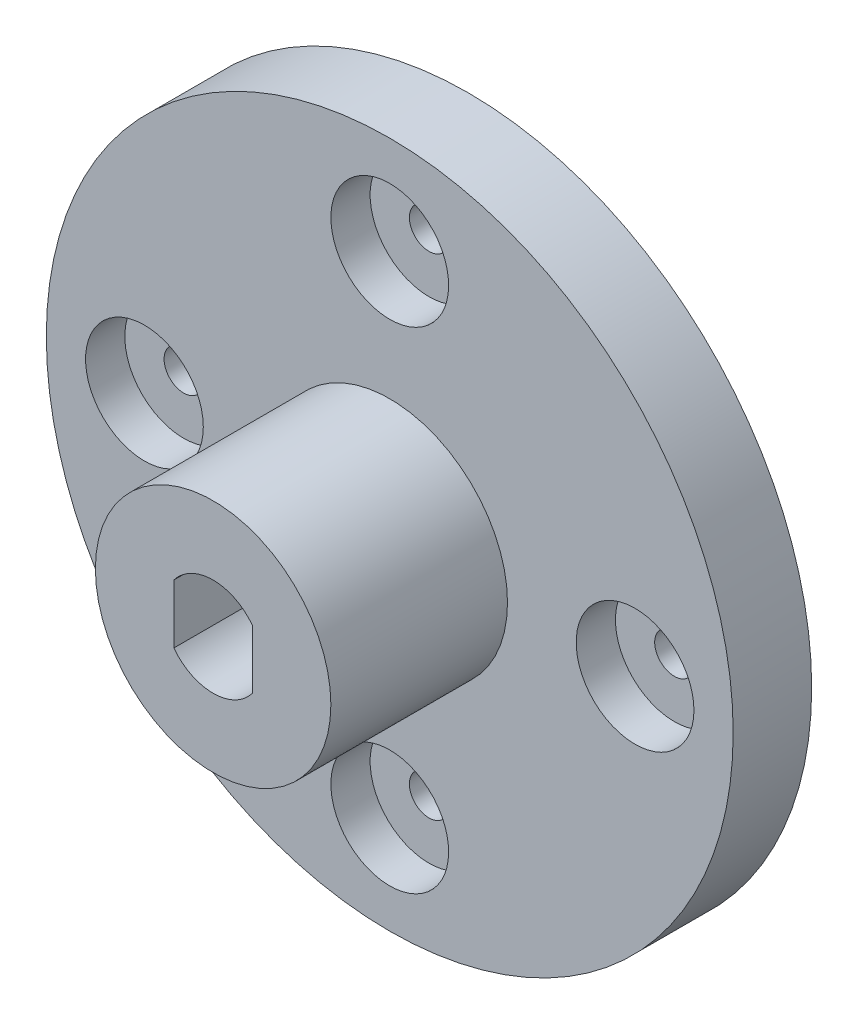
ISO-10303-21;
HEADER;
FILE_DESCRIPTION(('STEP AP214'),'2;1');
FILE_NAME('part.step','',(''),(''),'','','');
FILE_SCHEMA(('AUTOMOTIVE_DESIGN { 1 0 10303 214 1 1 1 1 }'));
ENDSEC;
DATA;
#1=APPLICATION_CONTEXT('core data for automotive mechanical design processes');
#2=APPLICATION_PROTOCOL_DEFINITION('international standard','automotive_design',2000,#1);
#3=PRODUCT_CONTEXT('',#1,'mechanical');
#4=PRODUCT('Part','Part','',(#3));
#5=PRODUCT_RELATED_PRODUCT_CATEGORY('part','',(#4));
#6=PRODUCT_DEFINITION_FORMATION('','',#4);
#7=PRODUCT_DEFINITION_CONTEXT('part definition',#1,'design');
#8=PRODUCT_DEFINITION('design','',#6,#7);
#9=PRODUCT_DEFINITION_SHAPE('','',#8);
#10=(LENGTH_UNIT() NAMED_UNIT(*) SI_UNIT(.MILLI.,.METRE.));
#11=(NAMED_UNIT(*) PLANE_ANGLE_UNIT() SI_UNIT($,.RADIAN.));
#12=(NAMED_UNIT(*) SI_UNIT($,.STERADIAN.) SOLID_ANGLE_UNIT());
#13=UNCERTAINTY_MEASURE_WITH_UNIT(LENGTH_MEASURE(1.E-05),#10,'distance_accuracy_value','');
#14=(GEOMETRIC_REPRESENTATION_CONTEXT(3) GLOBAL_UNCERTAINTY_ASSIGNED_CONTEXT((#13)) GLOBAL_UNIT_ASSIGNED_CONTEXT((#10,
#11,#12)) REPRESENTATION_CONTEXT('',''));
#15=CARTESIAN_POINT('',(0.,0.,0.));
#16=DIRECTION('',(0.,0.,1.));
#17=DIRECTION('',(1.,0.,0.));
#18=AXIS2_PLACEMENT_3D('',#15,#16,#17);
#19=CARTESIAN_POINT('',(0.,0.,9.));
#20=DIRECTION('',(0.,0.,-1.));
#21=DIRECTION('',(-1.,0.,0.));
#22=AXIS2_PLACEMENT_3D('',#19,#20,#21);
#23=CYLINDRICAL_SURFACE('',#22,2.5);
#24=CARTESIAN_POINT('',(0.,0.,0.));
#25=DIRECTION('',(0.,0.,1.));
#26=DIRECTION('',(1.,0.,0.));
#27=AXIS2_PLACEMENT_3D('',#24,#25,#26);
#28=CIRCLE('',#27,2.5);
#29=CARTESIAN_POINT('',(2.,1.5,0.));
#30=VERTEX_POINT('',#29);
#31=CARTESIAN_POINT('',(-2.,1.5,0.));
#32=VERTEX_POINT('',#31);
#33=EDGE_CURVE('E114',#30,#32,#28,.T.);
#34=ORIENTED_EDGE('',*,*,#33,.F.);
#35=DIRECTION('',(0.,0.,-1.));
#36=VECTOR('',#35,1.);
#37=CARTESIAN_POINT('',(2.,1.5,9.));
#38=LINE('',#37,#36);
#39=CARTESIAN_POINT('',(2.,1.5,9.));
#40=VERTEX_POINT('',#39);
#41=EDGE_CURVE('E12',#40,#30,#38,.T.);
#42=ORIENTED_EDGE('',*,*,#41,.F.);
#43=CARTESIAN_POINT('',(0.,0.,9.));
#44=DIRECTION('',(0.,0.,1.));
#45=DIRECTION('',(1.,0.,0.));
#46=AXIS2_PLACEMENT_3D('',#43,#44,#45);
#47=CIRCLE('',#46,2.5);
#48=CARTESIAN_POINT('',(-2.,1.5,9.));
#49=VERTEX_POINT('',#48);
#50=EDGE_CURVE('E96',#40,#49,#47,.T.);
#51=ORIENTED_EDGE('',*,*,#50,.T.);
#52=DIRECTION('',(0.,0.,-1.));
#53=VECTOR('',#52,1.);
#54=CARTESIAN_POINT('',(-2.,1.5,9.));
#55=LINE('',#54,#53);
#56=EDGE_CURVE('E63',#49,#32,#55,.T.);
#57=ORIENTED_EDGE('',*,*,#56,.T.);
#58=EDGE_LOOP('',(#34,#42,#51,#57));
#59=FACE_BOUND('',#58,.T.);
#60=ADVANCED_FACE('F47',(#59),#23,.F.);
#61=CARTESIAN_POINT('',(2.,0.,9.));
#62=DIRECTION('',(1.,0.,0.));
#63=DIRECTION('',(0.,0.,-1.));
#64=AXIS2_PLACEMENT_3D('',#61,#62,#63);
#65=PLANE('',#64);
#66=DIRECTION('',(0.,-1.,0.));
#67=VECTOR('',#66,1.);
#68=CARTESIAN_POINT('',(2.,0.,0.));
#69=LINE('',#68,#67);
#70=CARTESIAN_POINT('',(2.,-1.5,0.));
#71=VERTEX_POINT('',#70);
#72=EDGE_CURVE('E102',#30,#71,#69,.T.);
#73=ORIENTED_EDGE('',*,*,#72,.T.);
#74=DIRECTION('',(0.,0.,-1.));
#75=VECTOR('',#74,1.);
#76=CARTESIAN_POINT('',(2.,-1.5,9.));
#77=LINE('',#76,#75);
#78=CARTESIAN_POINT('',(2.,-1.5,9.));
#79=VERTEX_POINT('',#78);
#80=EDGE_CURVE('E55',#79,#71,#77,.T.);
#81=ORIENTED_EDGE('',*,*,#80,.F.);
#82=DIRECTION('',(0.,-1.,0.));
#83=VECTOR('',#82,1.);
#84=CARTESIAN_POINT('',(2.,0.,9.));
#85=LINE('',#84,#83);
#86=EDGE_CURVE('E89',#40,#79,#85,.T.);
#87=ORIENTED_EDGE('',*,*,#86,.F.);
#88=ORIENTED_EDGE('',*,*,#41,.T.);
#89=EDGE_LOOP('',(#73,#81,#87,#88));
#90=FACE_BOUND('',#89,.T.);
#91=ADVANCED_FACE('F100',(#90),#65,.F.);
#92=CARTESIAN_POINT('',(0.,0.,9.));
#93=DIRECTION('',(0.,0.,-1.));
#94=DIRECTION('',(-1.,0.,0.));
#95=AXIS2_PLACEMENT_3D('',#92,#93,#94);
#96=CYLINDRICAL_SURFACE('',#95,2.5);
#97=CARTESIAN_POINT('',(0.,0.,0.));
#98=DIRECTION('',(0.,0.,1.));
#99=DIRECTION('',(1.,0.,0.));
#100=AXIS2_PLACEMENT_3D('',#97,#98,#99);
#101=CIRCLE('',#100,2.5);
#102=CARTESIAN_POINT('',(-2.,-1.5,0.));
#103=VERTEX_POINT('',#102);
#104=EDGE_CURVE('E117',#103,#71,#101,.T.);
#105=ORIENTED_EDGE('',*,*,#104,.F.);
#106=DIRECTION('',(0.,0.,-1.));
#107=VECTOR('',#106,1.);
#108=CARTESIAN_POINT('',(-2.,-1.5,9.));
#109=LINE('',#108,#107);
#110=CARTESIAN_POINT('',(-2.,-1.5,9.));
#111=VERTEX_POINT('',#110);
#112=EDGE_CURVE('E76',#111,#103,#109,.T.);
#113=ORIENTED_EDGE('',*,*,#112,.F.);
#114=CARTESIAN_POINT('',(0.,0.,9.));
#115=DIRECTION('',(0.,0.,1.));
#116=DIRECTION('',(1.,0.,0.));
#117=AXIS2_PLACEMENT_3D('',#114,#115,#116);
#118=CIRCLE('',#117,2.5);
#119=EDGE_CURVE('E95',#111,#79,#118,.T.);
#120=ORIENTED_EDGE('',*,*,#119,.T.);
#121=ORIENTED_EDGE('',*,*,#80,.T.);
#122=EDGE_LOOP('',(#105,#113,#120,#121));
#123=FACE_BOUND('',#122,.T.);
#124=ADVANCED_FACE('F105',(#123),#96,.F.);
#125=CARTESIAN_POINT('',(-2.,0.,9.));
#126=DIRECTION('',(1.,0.,0.));
#127=DIRECTION('',(0.,0.,-1.));
#128=AXIS2_PLACEMENT_3D('',#125,#126,#127);
#129=PLANE('',#128);
#130=DIRECTION('',(0.,-1.,0.));
#131=VECTOR('',#130,1.);
#132=CARTESIAN_POINT('',(-2.,0.,0.));
#133=LINE('',#132,#131);
#134=EDGE_CURVE('E119',#32,#103,#133,.T.);
#135=ORIENTED_EDGE('',*,*,#134,.F.);
#136=ORIENTED_EDGE('',*,*,#56,.F.);
#137=DIRECTION('',(0.,-1.,0.));
#138=VECTOR('',#137,1.);
#139=CARTESIAN_POINT('',(-2.,0.,9.));
#140=LINE('',#139,#138);
#141=EDGE_CURVE('E106',#49,#111,#140,.T.);
#142=ORIENTED_EDGE('',*,*,#141,.T.);
#143=ORIENTED_EDGE('',*,*,#112,.T.);
#144=EDGE_LOOP('',(#135,#136,#142,#143));
#145=FACE_BOUND('',#144,.T.);
#146=ADVANCED_FACE('F128',(#145),#129,.T.);
#147=CARTESIAN_POINT('',(0.,0.,9.));
#148=DIRECTION('',(0.,0.,-1.));
#149=DIRECTION('',(-1.,0.,0.));
#150=AXIS2_PLACEMENT_3D('',#147,#148,#149);
#151=CYLINDRICAL_SURFACE('',#150,6.);
#152=CARTESIAN_POINT('',(0.,0.,9.));
#153=DIRECTION('',(0.,0.,1.));
#154=DIRECTION('',(1.,0.,0.));
#155=AXIS2_PLACEMENT_3D('',#152,#153,#154);
#156=CIRCLE('',#155,6.);
#157=CARTESIAN_POINT('',(6.,0.,9.));
#158=VERTEX_POINT('',#157);
#159=EDGE_CURVE('E108',#158,#158,#156,.T.);
#160=ORIENTED_EDGE('',*,*,#159,.F.);
#161=EDGE_LOOP('',(#160));
#162=FACE_BOUND('',#161,.T.);
#163=CARTESIAN_POINT('',(0.,0.,0.));
#164=DIRECTION('',(0.,0.,1.));
#165=DIRECTION('',(1.,0.,0.));
#166=AXIS2_PLACEMENT_3D('',#163,#164,#165);
#167=CIRCLE('',#166,6.);
#168=CARTESIAN_POINT('',(6.,0.,0.));
#169=VERTEX_POINT('',#168);
#170=EDGE_CURVE('E122',#169,#169,#167,.T.);
#171=ORIENTED_EDGE('',*,*,#170,.T.);
#172=EDGE_LOOP('',(#171));
#173=FACE_BOUND('',#172,.T.);
#174=ADVANCED_FACE('F130',(#162,#173),#151,.T.);
#175=CARTESIAN_POINT('',(0.,0.,9.));
#176=DIRECTION('',(0.,0.,1.));
#177=DIRECTION('',(1.,0.,0.));
#178=AXIS2_PLACEMENT_3D('',#175,#176,#177);
#179=PLANE('',#178);
#180=ORIENTED_EDGE('',*,*,#50,.F.);
#181=ORIENTED_EDGE('',*,*,#86,.T.);
#182=ORIENTED_EDGE('',*,*,#119,.F.);
#183=ORIENTED_EDGE('',*,*,#141,.F.);
#184=EDGE_LOOP('',(#180,#181,#182,#183));
#185=FACE_BOUND('',#184,.T.);
#186=ORIENTED_EDGE('',*,*,#159,.T.);
#187=EDGE_LOOP('',(#186));
#188=FACE_BOUND('',#187,.T.);
#189=ADVANCED_FACE('F91',(#185,#188),#179,.T.);
#190=CARTESIAN_POINT('',(0.,0.,0.));
#191=DIRECTION('',(0.,0.,1.));
#192=DIRECTION('',(1.,0.,0.));
#193=AXIS2_PLACEMENT_3D('',#190,#191,#192);
#194=PLANE('',#193);
#195=ORIENTED_EDGE('',*,*,#33,.T.);
#196=ORIENTED_EDGE('',*,*,#134,.T.);
#197=ORIENTED_EDGE('',*,*,#104,.T.);
#198=ORIENTED_EDGE('',*,*,#72,.F.);
#199=EDGE_LOOP('',(#195,#196,#197,#198));
#200=FACE_BOUND('',#199,.T.);
#201=ORIENTED_EDGE('',*,*,#170,.F.);
#202=EDGE_LOOP('',(#201));
#203=FACE_BOUND('',#202,.T.);
#204=ADVANCED_FACE('F171',(#200,#203),#194,.F.);
#205=CLOSED_SHELL('',(#60,#91,#124,#146,#174,#189,#204));
#206=MANIFOLD_SOLID_BREP('B2',#205);
#207=CARTESIAN_POINT('',(0.,-12.5,-4.));
#208=DIRECTION('',(0.,0.,1.));
#209=DIRECTION('',(1.,0.,0.));
#210=AXIS2_PLACEMENT_3D('',#207,#208,#209);
#211=CYLINDRICAL_SURFACE('',#210,1.);
#212=CARTESIAN_POINT('',(0.,-12.5,-4.));
#213=DIRECTION('',(0.,0.,1.));
#214=DIRECTION('',(1.,0.,0.));
#215=AXIS2_PLACEMENT_3D('',#212,#213,#214);
#216=CIRCLE('',#215,1.);
#217=CARTESIAN_POINT('',(0.999999999999913,-12.5,-4.));
#218=VERTEX_POINT('',#217);
#219=EDGE_CURVE('E46',#218,#218,#216,.T.);
#220=ORIENTED_EDGE('',*,*,#219,.F.);
#221=EDGE_LOOP('',(#220));
#222=FACE_BOUND('',#221,.T.);
#223=CARTESIAN_POINT('',(0.,-12.5,-2.));
#224=DIRECTION('',(0.,0.,1.));
#225=DIRECTION('',(1.,0.,0.));
#226=AXIS2_PLACEMENT_3D('',#223,#224,#225);
#227=CIRCLE('',#226,1.);
#228=CARTESIAN_POINT('',(0.999999999999913,-12.5,-2.));
#229=VERTEX_POINT('',#228);
#230=EDGE_CURVE('E286',#229,#229,#227,.T.);
#231=ORIENTED_EDGE('',*,*,#230,.T.);
#232=EDGE_LOOP('',(#231));
#233=FACE_BOUND('',#232,.T.);
#234=ADVANCED_FACE('F206',(#222,#233),#211,.F.);
#235=CARTESIAN_POINT('',(12.5,0.,-4.));
#236=DIRECTION('',(0.,0.,1.));
#237=DIRECTION('',(1.,0.,0.));
#238=AXIS2_PLACEMENT_3D('',#235,#236,#237);
#239=CYLINDRICAL_SURFACE('',#238,1.);
#240=CARTESIAN_POINT('',(12.5,0.,-4.));
#241=DIRECTION('',(0.,0.,1.));
#242=DIRECTION('',(1.,0.,0.));
#243=AXIS2_PLACEMENT_3D('',#240,#241,#242);
#244=CIRCLE('',#243,1.);
#245=CARTESIAN_POINT('',(13.5,0.,-4.));
#246=VERTEX_POINT('',#245);
#247=EDGE_CURVE('E214',#246,#246,#244,.T.);
#248=ORIENTED_EDGE('',*,*,#247,.F.);
#249=EDGE_LOOP('',(#248));
#250=FACE_BOUND('',#249,.T.);
#251=CARTESIAN_POINT('',(12.5,0.,-2.));
#252=DIRECTION('',(0.,0.,1.));
#253=DIRECTION('',(1.,0.,0.));
#254=AXIS2_PLACEMENT_3D('',#251,#252,#253);
#255=CIRCLE('',#254,1.);
#256=CARTESIAN_POINT('',(13.5,0.,-2.));
#257=VERTEX_POINT('',#256);
#258=EDGE_CURVE('E295',#257,#257,#255,.T.);
#259=ORIENTED_EDGE('',*,*,#258,.T.);
#260=EDGE_LOOP('',(#259));
#261=FACE_BOUND('',#260,.T.);
#262=ADVANCED_FACE('F249',(#250,#261),#239,.F.);
#263=CARTESIAN_POINT('',(0.,12.5,-4.));
#264=DIRECTION('',(0.,0.,1.));
#265=DIRECTION('',(1.,0.,0.));
#266=AXIS2_PLACEMENT_3D('',#263,#264,#265);
#267=CYLINDRICAL_SURFACE('',#266,1.);
#268=CARTESIAN_POINT('',(0.,12.5,-4.));
#269=DIRECTION('',(0.,0.,1.));
#270=DIRECTION('',(1.,0.,0.));
#271=AXIS2_PLACEMENT_3D('',#268,#269,#270);
#272=CIRCLE('',#271,1.);
#273=CARTESIAN_POINT('',(1.,12.5,-4.));
#274=VERTEX_POINT('',#273);
#275=EDGE_CURVE('E219',#274,#274,#272,.T.);
#276=ORIENTED_EDGE('',*,*,#275,.F.);
#277=EDGE_LOOP('',(#276));
#278=FACE_BOUND('',#277,.T.);
#279=CARTESIAN_POINT('',(0.,12.5,-2.));
#280=DIRECTION('',(0.,0.,1.));
#281=DIRECTION('',(1.,0.,0.));
#282=AXIS2_PLACEMENT_3D('',#279,#280,#281);
#283=CIRCLE('',#282,1.);
#284=CARTESIAN_POINT('',(1.,12.5,-2.));
#285=VERTEX_POINT('',#284);
#286=EDGE_CURVE('E253',#285,#285,#283,.T.);
#287=ORIENTED_EDGE('',*,*,#286,.T.);
#288=EDGE_LOOP('',(#287));
#289=FACE_BOUND('',#288,.T.);
#290=ADVANCED_FACE('F246',(#278,#289),#267,.F.);
#291=CARTESIAN_POINT('',(-12.5,1.30930550206618E-13,-4.));
#292=DIRECTION('',(0.,0.,1.));
#293=DIRECTION('',(1.,0.,0.));
#294=AXIS2_PLACEMENT_3D('',#291,#292,#293);
#295=CYLINDRICAL_SURFACE('',#294,1.);
#296=CARTESIAN_POINT('',(-12.5,1.30930550206618E-13,-4.));
#297=DIRECTION('',(0.,0.,1.));
#298=DIRECTION('',(1.,0.,0.));
#299=AXIS2_PLACEMENT_3D('',#296,#297,#298);
#300=CIRCLE('',#299,1.);
#301=CARTESIAN_POINT('',(-11.5,1.30930550206618E-13,-4.));
#302=VERTEX_POINT('',#301);
#303=EDGE_CURVE('E227',#302,#302,#300,.T.);
#304=ORIENTED_EDGE('',*,*,#303,.F.);
#305=EDGE_LOOP('',(#304));
#306=FACE_BOUND('',#305,.T.);
#307=CARTESIAN_POINT('',(-12.5,1.30930550206618E-13,-2.));
#308=DIRECTION('',(0.,0.,1.));
#309=DIRECTION('',(1.,0.,0.));
#310=AXIS2_PLACEMENT_3D('',#307,#308,#309);
#311=CIRCLE('',#310,1.);
#312=CARTESIAN_POINT('',(-11.5,1.30930550206618E-13,-2.));
#313=VERTEX_POINT('',#312);
#314=EDGE_CURVE('E275',#313,#313,#311,.T.);
#315=ORIENTED_EDGE('',*,*,#314,.T.);
#316=EDGE_LOOP('',(#315));
#317=FACE_BOUND('',#316,.T.);
#318=ADVANCED_FACE('F208',(#306,#317),#295,.F.);
#319=CARTESIAN_POINT('',(0.,0.,-4.));
#320=DIRECTION('',(0.,0.,1.));
#321=DIRECTION('',(1.,0.,0.));
#322=AXIS2_PLACEMENT_3D('',#319,#320,#321);
#323=CYLINDRICAL_SURFACE('',#322,1.5);
#324=CARTESIAN_POINT('',(0.,0.,0.));
#325=DIRECTION('',(0.,0.,1.));
#326=DIRECTION('',(1.,0.,0.));
#327=AXIS2_PLACEMENT_3D('',#324,#325,#326);
#328=CIRCLE('',#327,1.5);
#329=CARTESIAN_POINT('',(1.5,0.,0.));
#330=VERTEX_POINT('',#329);
#331=EDGE_CURVE('E225',#330,#330,#328,.T.);
#332=ORIENTED_EDGE('',*,*,#331,.T.);
#333=EDGE_LOOP('',(#332));
#334=FACE_BOUND('',#333,.T.);
#335=CARTESIAN_POINT('',(0.,0.,-2.));
#336=DIRECTION('',(0.,0.,-1.));
#337=DIRECTION('',(-1.,0.,0.));
#338=AXIS2_PLACEMENT_3D('',#335,#336,#337);
#339=CIRCLE('',#338,1.5);
#340=CARTESIAN_POINT('',(-1.5,0.,-2.));
#341=VERTEX_POINT('',#340);
#342=EDGE_CURVE('E210',#341,#341,#339,.F.);
#343=ORIENTED_EDGE('',*,*,#342,.F.);
#344=EDGE_LOOP('',(#343));
#345=FACE_BOUND('',#344,.T.);
#346=ADVANCED_FACE('F323',(#334,#345),#323,.F.);
#347=CARTESIAN_POINT('',(0.,0.,-4.));
#348=DIRECTION('',(0.,0.,1.));
#349=DIRECTION('',(1.,0.,0.));
#350=AXIS2_PLACEMENT_3D('',#347,#348,#349);
#351=CYLINDRICAL_SURFACE('',#350,17.5);
#352=CARTESIAN_POINT('',(0.,0.,-4.));
#353=DIRECTION('',(0.,0.,1.));
#354=DIRECTION('',(1.,0.,0.));
#355=AXIS2_PLACEMENT_3D('',#352,#353,#354);
#356=CIRCLE('',#355,17.5);
#357=CARTESIAN_POINT('',(17.5,0.,-4.));
#358=VERTEX_POINT('',#357);
#359=EDGE_CURVE('E231',#358,#358,#356,.T.);
#360=ORIENTED_EDGE('',*,*,#359,.T.);
#361=EDGE_LOOP('',(#360));
#362=FACE_BOUND('',#361,.T.);
#363=CARTESIAN_POINT('',(0.,0.,0.));
#364=DIRECTION('',(0.,0.,1.));
#365=DIRECTION('',(1.,0.,0.));
#366=AXIS2_PLACEMENT_3D('',#363,#364,#365);
#367=CIRCLE('',#366,17.5);
#368=CARTESIAN_POINT('',(17.5,0.,0.));
#369=VERTEX_POINT('',#368);
#370=EDGE_CURVE('E223',#369,#369,#367,.T.);
#371=ORIENTED_EDGE('',*,*,#370,.F.);
#372=EDGE_LOOP('',(#371));
#373=FACE_BOUND('',#372,.T.);
#374=ADVANCED_FACE('F321',(#362,#373),#351,.T.);
#375=CARTESIAN_POINT('',(0.,0.,-4.));
#376=DIRECTION('',(0.,0.,1.));
#377=DIRECTION('',(1.,0.,0.));
#378=AXIS2_PLACEMENT_3D('',#375,#376,#377);
#379=PLANE('',#378);
#380=CARTESIAN_POINT('',(0.,0.,-4.));
#381=DIRECTION('',(0.,0.,-1.));
#382=DIRECTION('',(-1.,0.,0.));
#383=AXIS2_PLACEMENT_3D('',#380,#381,#382);
#384=CIRCLE('',#383,2.5);
#385=CARTESIAN_POINT('',(-2.5,0.,-4.));
#386=VERTEX_POINT('',#385);
#387=EDGE_CURVE('E238',#386,#386,#384,.T.);
#388=ORIENTED_EDGE('',*,*,#387,.F.);
#389=EDGE_LOOP('',(#388));
#390=FACE_BOUND('',#389,.T.);
#391=ORIENTED_EDGE('',*,*,#303,.T.);
#392=EDGE_LOOP('',(#391));
#393=FACE_BOUND('',#392,.T.);
#394=ORIENTED_EDGE('',*,*,#359,.F.);
#395=EDGE_LOOP('',(#394));
#396=FACE_BOUND('',#395,.T.);
#397=ORIENTED_EDGE('',*,*,#275,.T.);
#398=EDGE_LOOP('',(#397));
#399=FACE_BOUND('',#398,.T.);
#400=ORIENTED_EDGE('',*,*,#247,.T.);
#401=EDGE_LOOP('',(#400));
#402=FACE_BOUND('',#401,.T.);
#403=ORIENTED_EDGE('',*,*,#219,.T.);
#404=EDGE_LOOP('',(#403));
#405=FACE_BOUND('',#404,.T.);
#406=ADVANCED_FACE('F243',(#390,#393,#396,#399,#402,#405),#379,.F.);
#407=CARTESIAN_POINT('',(0.,0.,0.));
#408=DIRECTION('',(0.,0.,1.));
#409=DIRECTION('',(1.,0.,0.));
#410=AXIS2_PLACEMENT_3D('',#407,#408,#409);
#411=PLANE('',#410);
#412=CARTESIAN_POINT('',(-12.5,1.30930550206618E-13,0.));
#413=DIRECTION('',(0.,0.,1.));
#414=DIRECTION('',(1.,0.,0.));
#415=AXIS2_PLACEMENT_3D('',#412,#413,#414);
#416=CIRCLE('',#415,3.);
#417=CARTESIAN_POINT('',(-9.5,1.30930550206618E-13,0.));
#418=VERTEX_POINT('',#417);
#419=EDGE_CURVE('E280',#418,#418,#416,.T.);
#420=ORIENTED_EDGE('',*,*,#419,.F.);
#421=EDGE_LOOP('',(#420));
#422=FACE_BOUND('',#421,.T.);
#423=CARTESIAN_POINT('',(0.,-12.5,0.));
#424=DIRECTION('',(0.,0.,1.));
#425=DIRECTION('',(1.,0.,0.));
#426=AXIS2_PLACEMENT_3D('',#423,#424,#425);
#427=CIRCLE('',#426,3.);
#428=CARTESIAN_POINT('',(2.99999999999991,-12.5,0.));
#429=VERTEX_POINT('',#428);
#430=EDGE_CURVE('E289',#429,#429,#427,.T.);
#431=ORIENTED_EDGE('',*,*,#430,.F.);
#432=EDGE_LOOP('',(#431));
#433=FACE_BOUND('',#432,.T.);
#434=CARTESIAN_POINT('',(12.5,0.,0.));
#435=DIRECTION('',(0.,0.,1.));
#436=DIRECTION('',(1.,0.,0.));
#437=AXIS2_PLACEMENT_3D('',#434,#435,#436);
#438=CIRCLE('',#437,3.);
#439=CARTESIAN_POINT('',(15.5,0.,0.));
#440=VERTEX_POINT('',#439);
#441=EDGE_CURVE('E259',#440,#440,#438,.T.);
#442=ORIENTED_EDGE('',*,*,#441,.F.);
#443=EDGE_LOOP('',(#442));
#444=FACE_BOUND('',#443,.T.);
#445=CARTESIAN_POINT('',(0.,12.5,0.));
#446=DIRECTION('',(0.,0.,1.));
#447=DIRECTION('',(1.,0.,0.));
#448=AXIS2_PLACEMENT_3D('',#445,#446,#447);
#449=CIRCLE('',#448,3.);
#450=CARTESIAN_POINT('',(3.,12.5,0.));
#451=VERTEX_POINT('',#450);
#452=EDGE_CURVE('E256',#451,#451,#449,.T.);
#453=ORIENTED_EDGE('',*,*,#452,.F.);
#454=EDGE_LOOP('',(#453));
#455=FACE_BOUND('',#454,.T.);
#456=ORIENTED_EDGE('',*,*,#370,.T.);
#457=EDGE_LOOP('',(#456));
#458=FACE_BOUND('',#457,.T.);
#459=ORIENTED_EDGE('',*,*,#331,.F.);
#460=EDGE_LOOP('',(#459));
#461=FACE_BOUND('',#460,.T.);
#462=ADVANCED_FACE('F310',(#422,#433,#444,#455,#458,#461),#411,.T.);
#463=CARTESIAN_POINT('',(0.,0.,-2.));
#464=DIRECTION('',(0.,0.,-1.));
#465=DIRECTION('',(-1.,0.,0.));
#466=AXIS2_PLACEMENT_3D('',#463,#464,#465);
#467=PLANE('',#466);
#468=CARTESIAN_POINT('',(0.,0.,-2.));
#469=DIRECTION('',(0.,0.,-1.));
#470=DIRECTION('',(-1.,0.,0.));
#471=AXIS2_PLACEMENT_3D('',#468,#469,#470);
#472=CIRCLE('',#471,2.5);
#473=CARTESIAN_POINT('',(-2.5,0.,-2.));
#474=VERTEX_POINT('',#473);
#475=EDGE_CURVE('E265',#474,#474,#472,.T.);
#476=ORIENTED_EDGE('',*,*,#475,.T.);
#477=EDGE_LOOP('',(#476));
#478=FACE_BOUND('',#477,.T.);
#479=ORIENTED_EDGE('',*,*,#342,.T.);
#480=EDGE_LOOP('',(#479));
#481=FACE_BOUND('',#480,.T.);
#482=ADVANCED_FACE('F313',(#478,#481),#467,.T.);
#483=CARTESIAN_POINT('',(0.,0.,-2.));
#484=DIRECTION('',(0.,0.,-1.));
#485=DIRECTION('',(-1.,0.,0.));
#486=AXIS2_PLACEMENT_3D('',#483,#484,#485);
#487=CYLINDRICAL_SURFACE('',#486,2.5);
#488=ORIENTED_EDGE('',*,*,#475,.F.);
#489=EDGE_LOOP('',(#488));
#490=FACE_BOUND('',#489,.T.);
#491=ORIENTED_EDGE('',*,*,#387,.T.);
#492=EDGE_LOOP('',(#491));
#493=FACE_BOUND('',#492,.T.);
#494=ADVANCED_FACE('F342',(#490,#493),#487,.F.);
#495=CARTESIAN_POINT('',(0.,12.5,-2.));
#496=DIRECTION('',(0.,0.,1.));
#497=DIRECTION('',(1.,0.,0.));
#498=AXIS2_PLACEMENT_3D('',#495,#496,#497);
#499=CYLINDRICAL_SURFACE('',#498,3.);
#500=CARTESIAN_POINT('',(0.,12.5,-2.));
#501=DIRECTION('',(0.,0.,1.));
#502=DIRECTION('',(1.,0.,0.));
#503=AXIS2_PLACEMENT_3D('',#500,#501,#502);
#504=CIRCLE('',#503,3.);
#505=CARTESIAN_POINT('',(3.,12.5,-2.));
#506=VERTEX_POINT('',#505);
#507=EDGE_CURVE('E255',#506,#506,#504,.T.);
#508=ORIENTED_EDGE('',*,*,#507,.F.);
#509=EDGE_LOOP('',(#508));
#510=FACE_BOUND('',#509,.T.);
#511=ORIENTED_EDGE('',*,*,#452,.T.);
#512=EDGE_LOOP('',(#511));
#513=FACE_BOUND('',#512,.T.);
#514=ADVANCED_FACE('F345',(#510,#513),#499,.F.);
#515=CARTESIAN_POINT('',(0.,0.,-2.));
#516=DIRECTION('',(0.,0.,1.));
#517=DIRECTION('',(1.,0.,0.));
#518=AXIS2_PLACEMENT_3D('',#515,#516,#517);
#519=PLANE('',#518);
#520=ORIENTED_EDGE('',*,*,#286,.F.);
#521=EDGE_LOOP('',(#520));
#522=FACE_BOUND('',#521,.T.);
#523=ORIENTED_EDGE('',*,*,#507,.T.);
#524=EDGE_LOOP('',(#523));
#525=FACE_BOUND('',#524,.T.);
#526=ADVANCED_FACE('F305',(#522,#525),#519,.T.);
#527=CARTESIAN_POINT('',(12.5,0.,-2.));
#528=DIRECTION('',(0.,0.,1.));
#529=DIRECTION('',(1.,0.,0.));
#530=AXIS2_PLACEMENT_3D('',#527,#528,#529);
#531=CYLINDRICAL_SURFACE('',#530,3.);
#532=CARTESIAN_POINT('',(12.5,0.,-2.));
#533=DIRECTION('',(0.,0.,1.));
#534=DIRECTION('',(1.,0.,0.));
#535=AXIS2_PLACEMENT_3D('',#532,#533,#534);
#536=CIRCLE('',#535,3.);
#537=CARTESIAN_POINT('',(15.5,0.,-2.));
#538=VERTEX_POINT('',#537);
#539=EDGE_CURVE('E294',#538,#538,#536,.T.);
#540=ORIENTED_EDGE('',*,*,#539,.F.);
#541=EDGE_LOOP('',(#540));
#542=FACE_BOUND('',#541,.T.);
#543=ORIENTED_EDGE('',*,*,#441,.T.);
#544=EDGE_LOOP('',(#543));
#545=FACE_BOUND('',#544,.T.);
#546=ADVANCED_FACE('F302',(#542,#545),#531,.F.);
#547=CARTESIAN_POINT('',(0.,0.,-2.));
#548=DIRECTION('',(0.,0.,1.));
#549=DIRECTION('',(1.,0.,0.));
#550=AXIS2_PLACEMENT_3D('',#547,#548,#549);
#551=PLANE('',#550);
#552=ORIENTED_EDGE('',*,*,#258,.F.);
#553=EDGE_LOOP('',(#552));
#554=FACE_BOUND('',#553,.T.);
#555=ORIENTED_EDGE('',*,*,#539,.T.);
#556=EDGE_LOOP('',(#555));
#557=FACE_BOUND('',#556,.T.);
#558=ADVANCED_FACE('F300',(#554,#557),#551,.T.);
#559=CARTESIAN_POINT('',(0.,-12.5,-2.));
#560=DIRECTION('',(0.,0.,1.));
#561=DIRECTION('',(1.,0.,0.));
#562=AXIS2_PLACEMENT_3D('',#559,#560,#561);
#563=CYLINDRICAL_SURFACE('',#562,3.);
#564=CARTESIAN_POINT('',(0.,-12.5,-2.));
#565=DIRECTION('',(0.,0.,1.));
#566=DIRECTION('',(1.,0.,0.));
#567=AXIS2_PLACEMENT_3D('',#564,#565,#566);
#568=CIRCLE('',#567,3.);
#569=CARTESIAN_POINT('',(2.99999999999991,-12.5,-2.));
#570=VERTEX_POINT('',#569);
#571=EDGE_CURVE('E285',#570,#570,#568,.T.);
#572=ORIENTED_EDGE('',*,*,#571,.F.);
#573=EDGE_LOOP('',(#572));
#574=FACE_BOUND('',#573,.T.);
#575=ORIENTED_EDGE('',*,*,#430,.T.);
#576=EDGE_LOOP('',(#575));
#577=FACE_BOUND('',#576,.T.);
#578=ADVANCED_FACE('F356',(#574,#577),#563,.F.);
#579=CARTESIAN_POINT('',(0.,0.,-2.));
#580=DIRECTION('',(0.,0.,1.));
#581=DIRECTION('',(1.,0.,0.));
#582=AXIS2_PLACEMENT_3D('',#579,#580,#581);
#583=PLANE('',#582);
#584=ORIENTED_EDGE('',*,*,#230,.F.);
#585=EDGE_LOOP('',(#584));
#586=FACE_BOUND('',#585,.T.);
#587=ORIENTED_EDGE('',*,*,#571,.T.);
#588=EDGE_LOOP('',(#587));
#589=FACE_BOUND('',#588,.T.);
#590=ADVANCED_FACE('F360',(#586,#589),#583,.T.);
#591=CARTESIAN_POINT('',(-12.5,1.30930550206618E-13,-2.));
#592=DIRECTION('',(0.,0.,1.));
#593=DIRECTION('',(1.,0.,0.));
#594=AXIS2_PLACEMENT_3D('',#591,#592,#593);
#595=CYLINDRICAL_SURFACE('',#594,3.);
#596=CARTESIAN_POINT('',(-12.5,1.30930550206618E-13,-2.));
#597=DIRECTION('',(0.,0.,1.));
#598=DIRECTION('',(1.,0.,0.));
#599=AXIS2_PLACEMENT_3D('',#596,#597,#598);
#600=CIRCLE('',#599,3.);
#601=CARTESIAN_POINT('',(-9.5,1.30930550206618E-13,-2.));
#602=VERTEX_POINT('',#601);
#603=EDGE_CURVE('E271',#602,#602,#600,.T.);
#604=ORIENTED_EDGE('',*,*,#603,.F.);
#605=EDGE_LOOP('',(#604));
#606=FACE_BOUND('',#605,.T.);
#607=ORIENTED_EDGE('',*,*,#419,.T.);
#608=EDGE_LOOP('',(#607));
#609=FACE_BOUND('',#608,.T.);
#610=ADVANCED_FACE('F364',(#606,#609),#595,.F.);
#611=CARTESIAN_POINT('',(0.,0.,-2.));
#612=DIRECTION('',(0.,0.,1.));
#613=DIRECTION('',(1.,0.,0.));
#614=AXIS2_PLACEMENT_3D('',#611,#612,#613);
#615=PLANE('',#614);
#616=ORIENTED_EDGE('',*,*,#314,.F.);
#617=EDGE_LOOP('',(#616));
#618=FACE_BOUND('',#617,.T.);
#619=ORIENTED_EDGE('',*,*,#603,.T.);
#620=EDGE_LOOP('',(#619));
#621=FACE_BOUND('',#620,.T.);
#622=ADVANCED_FACE('F368',(#618,#621),#615,.T.);
#623=CLOSED_SHELL('',(#234,#262,#290,#318,#346,#374,#406,#462,#482,#494,#514,#526,#546,#558,
#578,#590,#610,#622));
#624=MANIFOLD_SOLID_BREP('B6',#623);
#625=ADVANCED_BREP_SHAPE_REPRESENTATION('',(#18,#206,#624),#14);
#626=SHAPE_DEFINITION_REPRESENTATION(#9,#625);
ENDSEC;
END-ISO-10303-21;
